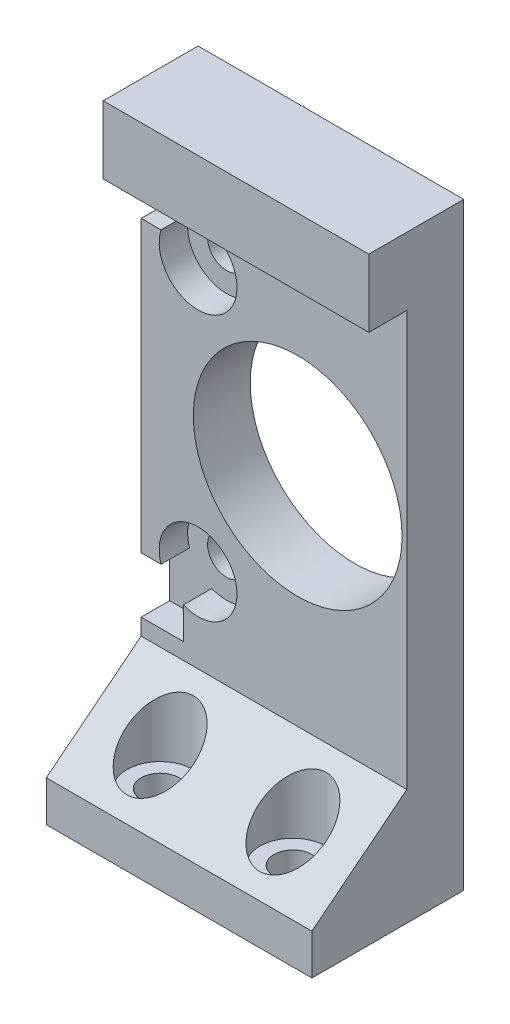
ISO-10303-21;
HEADER;
FILE_DESCRIPTION(('STEP AP214'),'2;1');
FILE_NAME('part.step','',(''),(''),'','','');
FILE_SCHEMA(('AUTOMOTIVE_DESIGN { 1 0 10303 214 1 1 1 1 }'));
ENDSEC;
DATA;
#1=APPLICATION_CONTEXT('core data for automotive mechanical design processes');
#2=APPLICATION_PROTOCOL_DEFINITION('international standard','automotive_design',2000,#1);
#3=PRODUCT_CONTEXT('',#1,'mechanical');
#4=PRODUCT('Part','Part','',(#3));
#5=PRODUCT_RELATED_PRODUCT_CATEGORY('part','',(#4));
#6=PRODUCT_DEFINITION_FORMATION('','',#4);
#7=PRODUCT_DEFINITION_CONTEXT('part definition',#1,'design');
#8=PRODUCT_DEFINITION('design','',#6,#7);
#9=PRODUCT_DEFINITION_SHAPE('','',#8);
#10=(LENGTH_UNIT() NAMED_UNIT(*) SI_UNIT(.MILLI.,.METRE.));
#11=(NAMED_UNIT(*) PLANE_ANGLE_UNIT() SI_UNIT($,.RADIAN.));
#12=(NAMED_UNIT(*) SI_UNIT($,.STERADIAN.) SOLID_ANGLE_UNIT());
#13=UNCERTAINTY_MEASURE_WITH_UNIT(LENGTH_MEASURE(1.E-05),#10,'distance_accuracy_value','');
#14=(GEOMETRIC_REPRESENTATION_CONTEXT(3) GLOBAL_UNCERTAINTY_ASSIGNED_CONTEXT((#13)) GLOBAL_UNIT_ASSIGNED_CONTEXT((#10,
#11,#12)) REPRESENTATION_CONTEXT('',''));
#15=CARTESIAN_POINT('',(0.,0.,0.));
#16=DIRECTION('',(0.,0.,1.));
#17=DIRECTION('',(1.,0.,0.));
#18=AXIS2_PLACEMENT_3D('',#15,#16,#17);
#19=CARTESIAN_POINT('',(0.,0.,6.));
#20=DIRECTION('',(0.,0.,-1.));
#21=DIRECTION('',(-1.,0.,0.));
#22=AXIS2_PLACEMENT_3D('',#19,#20,#21);
#23=PLANE('',#22);
#24=CARTESIAN_POINT('',(-24.1870503597122,36.9280575539568,6.));
#25=DIRECTION('',(0.,0.,-1.));
#26=DIRECTION('',(-1.,0.,0.));
#27=AXIS2_PLACEMENT_3D('',#24,#25,#26);
#28=CIRCLE('',#27,11.);
#29=CARTESIAN_POINT('',(-35.1870503597122,36.9280575539568,6.));
#30=VERTEX_POINT('',#29);
#31=EDGE_CURVE('E263',#30,#30,#28,.F.);
#32=ORIENTED_EDGE('',*,*,#31,.F.);
#33=EDGE_LOOP('',(#32));
#34=FACE_BOUND('',#33,.T.);
#35=DIRECTION('',(1.,0.,0.));
#36=VECTOR('',#35,1.);
#37=CARTESIAN_POINT('',(0.,52.1914288917122,6.));
#38=LINE('',#37,#36);
#39=CARTESIAN_POINT('',(-40.6870503597122,52.1914288917122,6.));
#40=VERTEX_POINT('',#39);
#41=CARTESIAN_POINT('',(-38.5875494127743,52.1914288917122,6.));
#42=VERTEX_POINT('',#41);
#43=EDGE_CURVE('E243',#40,#42,#38,.T.);
#44=ORIENTED_EDGE('',*,*,#43,.F.);
#45=DIRECTION('',(0.,-1.,0.));
#46=VECTOR('',#45,1.);
#47=CARTESIAN_POINT('',(-40.6870503597122,0.,6.));
#48=LINE('',#47,#46);
#49=CARTESIAN_POINT('',(-40.6870503597122,21.6646862162014,6.));
#50=VERTEX_POINT('',#49);
#51=EDGE_CURVE('E294',#40,#50,#48,.T.);
#52=ORIENTED_EDGE('',*,*,#51,.T.);
#53=DIRECTION('',(1.,0.,0.));
#54=VECTOR('',#53,1.);
#55=CARTESIAN_POINT('',(0.,21.6646862162014,6.));
#56=LINE('',#55,#54);
#57=CARTESIAN_POINT('',(-38.5875494127743,21.6646862162014,6.));
#58=VERTEX_POINT('',#57);
#59=EDGE_CURVE('E223',#50,#58,#56,.T.);
#60=ORIENTED_EDGE('',*,*,#59,.T.);
#61=CARTESIAN_POINT('',(-34.6870503597123,22.9280575539568,6.));
#62=DIRECTION('',(0.,0.,1.));
#63=DIRECTION('',(1.,0.,0.));
#64=AXIS2_PLACEMENT_3D('',#61,#62,#63);
#65=CIRCLE('',#64,4.1);
#66=CARTESIAN_POINT('',(-36.2374996052337,19.1325197610924,6.));
#67=VERTEX_POINT('',#66);
#68=EDGE_CURVE('E195',#67,#58,#65,.T.);
#69=ORIENTED_EDGE('',*,*,#68,.F.);
#70=DIRECTION('',(0.,1.,0.));
#71=VECTOR('',#70,1.);
#72=CARTESIAN_POINT('',(-36.2374996052337,0.,6.));
#73=LINE('',#72,#71);
#74=CARTESIAN_POINT('',(-36.2374996052337,15.7891322785426,6.));
#75=VERTEX_POINT('',#74);
#76=EDGE_CURVE('E227',#75,#67,#73,.T.);
#77=ORIENTED_EDGE('',*,*,#76,.F.);
#78=DIRECTION('',(-1.,0.,0.));
#79=VECTOR('',#78,1.);
#80=CARTESIAN_POINT('',(-44.6870503597123,15.7891322785426,6.));
#81=LINE('',#80,#79);
#82=CARTESIAN_POINT('',(-40.6870503597122,15.7891322785426,6.));
#83=VERTEX_POINT('',#82);
#84=EDGE_CURVE('E174',#75,#83,#81,.T.);
#85=ORIENTED_EDGE('',*,*,#84,.T.);
#86=CARTESIAN_POINT('',(-40.6870503597122,14.0583603420339,6.));
#87=VERTEX_POINT('',#86);
#88=EDGE_CURVE('E285',#83,#87,#48,.T.);
#89=ORIENTED_EDGE('',*,*,#88,.T.);
#90=DIRECTION('',(1.,0.,0.));
#91=VECTOR('',#90,1.);
#92=CARTESIAN_POINT('',(-44.6870503597123,14.0583603420339,6.));
#93=LINE('',#92,#91);
#94=CARTESIAN_POINT('',(-12.6870503597123,14.0583603420339,6.));
#95=VERTEX_POINT('',#94);
#96=EDGE_CURVE('E172',#87,#95,#93,.T.);
#97=ORIENTED_EDGE('',*,*,#96,.T.);
#98=DIRECTION('',(0.,1.,0.));
#99=VECTOR('',#98,1.);
#100=CARTESIAN_POINT('',(-12.6870503597123,0.,6.));
#101=LINE('',#100,#99);
#102=CARTESIAN_POINT('',(-12.6870503597122,57.7891322785426,6.));
#103=VERTEX_POINT('',#102);
#104=EDGE_CURVE('E188',#95,#103,#101,.T.);
#105=ORIENTED_EDGE('',*,*,#104,.T.);
#106=DIRECTION('',(-1.,0.,0.));
#107=VECTOR('',#106,1.);
#108=CARTESIAN_POINT('',(-44.6870503597123,57.7891322785426,6.));
#109=LINE('',#108,#107);
#110=CARTESIAN_POINT('',(-36.2374996052337,57.7891322785426,6.));
#111=VERTEX_POINT('',#110);
#112=EDGE_CURVE('E261',#103,#111,#109,.T.);
#113=ORIENTED_EDGE('',*,*,#112,.T.);
#114=DIRECTION('',(0.,-1.,0.));
#115=VECTOR('',#114,1.);
#116=CARTESIAN_POINT('',(-36.2374996052337,0.,6.));
#117=LINE('',#116,#115);
#118=CARTESIAN_POINT('',(-36.2374996052337,54.7235953468212,6.));
#119=VERTEX_POINT('',#118);
#120=EDGE_CURVE('E238',#111,#119,#117,.T.);
#121=ORIENTED_EDGE('',*,*,#120,.T.);
#122=CARTESIAN_POINT('',(-34.6870503597123,50.9280575539568,6.));
#123=DIRECTION('',(0.,0.,1.));
#124=DIRECTION('',(1.,0.,0.));
#125=AXIS2_PLACEMENT_3D('',#122,#123,#124);
#126=CIRCLE('',#125,4.1);
#127=EDGE_CURVE('E199',#42,#119,#126,.T.);
#128=ORIENTED_EDGE('',*,*,#127,.F.);
#129=EDGE_LOOP('',(#44,#52,#60,#69,#77,#85,#89,#97,#105,#113,#121,#128));
#130=FACE_BOUND('',#129,.T.);
#131=ADVANCED_FACE('F35',(#34,#130),#23,.F.);
#132=CARTESIAN_POINT('',(-34.6870503597123,50.9280575539568,-4.));
#133=DIRECTION('',(0.,0.,1.));
#134=DIRECTION('',(1.,0.,0.));
#135=AXIS2_PLACEMENT_3D('',#132,#133,#134);
#136=CYLINDRICAL_SURFACE('',#135,2.);
#137=CARTESIAN_POINT('',(-34.6870503597123,50.9280575539568,0.));
#138=DIRECTION('',(0.,0.,1.));
#139=DIRECTION('',(1.,0.,0.));
#140=AXIS2_PLACEMENT_3D('',#137,#138,#139);
#141=CIRCLE('',#140,2.);
#142=CARTESIAN_POINT('',(-32.6870503597122,50.9280575539568,0.));
#143=VERTEX_POINT('',#142);
#144=EDGE_CURVE('E254',#143,#143,#141,.T.);
#145=ORIENTED_EDGE('',*,*,#144,.F.);
#146=EDGE_LOOP('',(#145));
#147=FACE_BOUND('',#146,.T.);
#148=CARTESIAN_POINT('',(-34.6870503597123,50.9280575539568,3.));
#149=DIRECTION('',(0.,0.,1.));
#150=DIRECTION('',(1.,0.,0.));
#151=AXIS2_PLACEMENT_3D('',#148,#149,#150);
#152=CIRCLE('',#151,2.);
#153=CARTESIAN_POINT('',(-32.6870503597122,50.9280575539568,3.));
#154=VERTEX_POINT('',#153);
#155=EDGE_CURVE('E211',#154,#154,#152,.F.);
#156=ORIENTED_EDGE('',*,*,#155,.F.);
#157=EDGE_LOOP('',(#156));
#158=FACE_BOUND('',#157,.T.);
#159=ADVANCED_FACE('F372',(#147,#158),#136,.F.);
#160=CARTESIAN_POINT('',(-34.6870503597123,22.9280575539568,-4.));
#161=DIRECTION('',(0.,0.,1.));
#162=DIRECTION('',(1.,0.,0.));
#163=AXIS2_PLACEMENT_3D('',#160,#161,#162);
#164=CYLINDRICAL_SURFACE('',#163,2.);
#165=CARTESIAN_POINT('',(-34.6870503597123,22.9280575539568,0.));
#166=DIRECTION('',(0.,0.,1.));
#167=DIRECTION('',(1.,0.,0.));
#168=AXIS2_PLACEMENT_3D('',#165,#166,#167);
#169=CIRCLE('',#168,2.);
#170=CARTESIAN_POINT('',(-32.6870503597122,22.9280575539568,0.));
#171=VERTEX_POINT('',#170);
#172=EDGE_CURVE('E257',#171,#171,#169,.T.);
#173=ORIENTED_EDGE('',*,*,#172,.F.);
#174=EDGE_LOOP('',(#173));
#175=FACE_BOUND('',#174,.T.);
#176=CARTESIAN_POINT('',(-34.6870503597123,22.9280575539568,3.));
#177=DIRECTION('',(0.,0.,1.));
#178=DIRECTION('',(1.,0.,0.));
#179=AXIS2_PLACEMENT_3D('',#176,#177,#178);
#180=CIRCLE('',#179,2.);
#181=CARTESIAN_POINT('',(-32.6870503597122,22.9280575539568,3.));
#182=VERTEX_POINT('',#181);
#183=EDGE_CURVE('E220',#182,#182,#180,.F.);
#184=ORIENTED_EDGE('',*,*,#183,.F.);
#185=EDGE_LOOP('',(#184));
#186=FACE_BOUND('',#185,.T.);
#187=ADVANCED_FACE('F378',(#175,#186),#164,.F.);
#188=CARTESIAN_POINT('',(0.,0.,10.));
#189=DIRECTION('',(0.,0.,1.));
#190=DIRECTION('',(1.,0.,0.));
#191=AXIS2_PLACEMENT_3D('',#188,#189,#190);
#192=PLANE('',#191);
#193=DIRECTION('',(0.,1.,0.));
#194=VECTOR('',#193,1.);
#195=CARTESIAN_POINT('',(-40.6870503597122,0.,10.));
#196=LINE('',#195,#194);
#197=CARTESIAN_POINT('',(-40.6870503597122,57.7891322785426,10.));
#198=VERTEX_POINT('',#197);
#199=CARTESIAN_POINT('',(-40.6870503597122,64.9280575539568,10.));
#200=VERTEX_POINT('',#199);
#201=EDGE_CURVE('E335',#198,#200,#196,.T.);
#202=ORIENTED_EDGE('',*,*,#201,.F.);
#203=DIRECTION('',(-1.,0.,0.));
#204=VECTOR('',#203,1.);
#205=CARTESIAN_POINT('',(-44.6870503597123,57.7891322785426,10.));
#206=LINE('',#205,#204);
#207=CARTESIAN_POINT('',(-12.6870503597122,57.7891322785426,10.));
#208=VERTEX_POINT('',#207);
#209=EDGE_CURVE('E260',#208,#198,#206,.T.);
#210=ORIENTED_EDGE('',*,*,#209,.F.);
#211=DIRECTION('',(0.,-1.,0.));
#212=VECTOR('',#211,1.);
#213=CARTESIAN_POINT('',(-12.6870503597123,0.,10.));
#214=LINE('',#213,#212);
#215=CARTESIAN_POINT('',(-12.6870503597122,64.9280575539568,10.));
#216=VERTEX_POINT('',#215);
#217=EDGE_CURVE('E193',#216,#208,#214,.T.);
#218=ORIENTED_EDGE('',*,*,#217,.F.);
#219=DIRECTION('',(1.,0.,0.));
#220=VECTOR('',#219,1.);
#221=CARTESIAN_POINT('',(-76.1870503597122,64.9280575539568,10.));
#222=LINE('',#221,#220);
#223=EDGE_CURVE('E270',#200,#216,#222,.T.);
#224=ORIENTED_EDGE('',*,*,#223,.F.);
#225=EDGE_LOOP('',(#202,#210,#218,#224));
#226=FACE_BOUND('',#225,.T.);
#227=ADVANCED_FACE('F395',(#226),#192,.T.);
#228=CARTESIAN_POINT('',(0.,0.,0.));
#229=DIRECTION('',(0.,0.,1.));
#230=DIRECTION('',(1.,0.,0.));
#231=AXIS2_PLACEMENT_3D('',#228,#229,#230);
#232=PLANE('',#231);
#233=DIRECTION('',(0.,1.,0.));
#234=VECTOR('',#233,1.);
#235=CARTESIAN_POINT('',(-12.6870503597122,64.9280575539568,0.));
#236=LINE('',#235,#234);
#237=CARTESIAN_POINT('',(-12.6870503597123,1.84805755395684,0.));
#238=VERTEX_POINT('',#237);
#239=CARTESIAN_POINT('',(-12.6870503597122,64.9280575539568,0.));
#240=VERTEX_POINT('',#239);
#241=EDGE_CURVE('E183',#238,#240,#236,.T.);
#242=ORIENTED_EDGE('',*,*,#241,.F.);
#243=DIRECTION('',(-1.,0.,0.));
#244=VECTOR('',#243,1.);
#245=CARTESIAN_POINT('',(0.,1.84805755395684,0.));
#246=LINE('',#245,#244);
#247=CARTESIAN_POINT('',(-40.6870503597122,1.84805755395684,0.));
#248=VERTEX_POINT('',#247);
#249=EDGE_CURVE('E154',#238,#248,#246,.T.);
#250=ORIENTED_EDGE('',*,*,#249,.T.);
#251=DIRECTION('',(0.,1.,0.));
#252=VECTOR('',#251,1.);
#253=CARTESIAN_POINT('',(-40.6870503597122,0.,0.));
#254=LINE('',#253,#252);
#255=CARTESIAN_POINT('',(-40.6870503597122,64.9280575539568,0.));
#256=VERTEX_POINT('',#255);
#257=EDGE_CURVE('E340',#248,#256,#254,.T.);
#258=ORIENTED_EDGE('',*,*,#257,.T.);
#259=DIRECTION('',(1.,0.,0.));
#260=VECTOR('',#259,1.);
#261=CARTESIAN_POINT('',(-76.1870503597122,64.9280575539568,0.));
#262=LINE('',#261,#260);
#263=EDGE_CURVE('E269',#256,#240,#262,.T.);
#264=ORIENTED_EDGE('',*,*,#263,.T.);
#265=EDGE_LOOP('',(#242,#250,#258,#264));
#266=FACE_BOUND('',#265,.T.);
#267=ORIENTED_EDGE('',*,*,#172,.T.);
#268=EDGE_LOOP('',(#267));
#269=FACE_BOUND('',#268,.T.);
#270=ORIENTED_EDGE('',*,*,#144,.T.);
#271=EDGE_LOOP('',(#270));
#272=FACE_BOUND('',#271,.T.);
#273=CARTESIAN_POINT('',(-24.1870503597122,36.9280575539568,0.));
#274=DIRECTION('',(0.,0.,-1.));
#275=DIRECTION('',(-1.,0.,0.));
#276=AXIS2_PLACEMENT_3D('',#273,#274,#275);
#277=CIRCLE('',#276,11.);
#278=CARTESIAN_POINT('',(-35.1870503597122,36.9280575539568,0.));
#279=VERTEX_POINT('',#278);
#280=EDGE_CURVE('E266',#279,#279,#277,.T.);
#281=ORIENTED_EDGE('',*,*,#280,.F.);
#282=EDGE_LOOP('',(#281));
#283=FACE_BOUND('',#282,.T.);
#284=ADVANCED_FACE('F397',(#266,#269,#272,#283),#232,.F.);
#285=CARTESIAN_POINT('',(-76.1870503597122,64.9280575539568,10.));
#286=DIRECTION('',(0.,1.,0.));
#287=DIRECTION('',(0.,0.,1.));
#288=AXIS2_PLACEMENT_3D('',#285,#286,#287);
#289=PLANE('',#288);
#290=DIRECTION('',(0.,0.,-1.));
#291=VECTOR('',#290,1.);
#292=CARTESIAN_POINT('',(-40.6870503597122,64.9280575539568,10.));
#293=LINE('',#292,#291);
#294=EDGE_CURVE('E337',#200,#256,#293,.T.);
#295=ORIENTED_EDGE('',*,*,#294,.F.);
#296=ORIENTED_EDGE('',*,*,#223,.T.);
#297=DIRECTION('',(0.,0.,-1.));
#298=VECTOR('',#297,1.);
#299=CARTESIAN_POINT('',(-12.6870503597122,64.9280575539568,23.));
#300=LINE('',#299,#298);
#301=EDGE_CURVE('E185',#216,#240,#300,.T.);
#302=ORIENTED_EDGE('',*,*,#301,.T.);
#303=ORIENTED_EDGE('',*,*,#263,.F.);
#304=EDGE_LOOP('',(#295,#296,#302,#303));
#305=FACE_BOUND('',#304,.T.);
#306=ADVANCED_FACE('F37',(#305),#289,.T.);
#307=CARTESIAN_POINT('',(-24.1870503597122,36.9280575539568,50.));
#308=DIRECTION('',(0.,0.,-1.));
#309=DIRECTION('',(-1.,0.,0.));
#310=AXIS2_PLACEMENT_3D('',#307,#308,#309);
#311=CYLINDRICAL_SURFACE('',#310,11.);
#312=ORIENTED_EDGE('',*,*,#31,.T.);
#313=EDGE_LOOP('',(#312));
#314=FACE_BOUND('',#313,.T.);
#315=ORIENTED_EDGE('',*,*,#280,.T.);
#316=EDGE_LOOP('',(#315));
#317=FACE_BOUND('',#316,.T.);
#318=ADVANCED_FACE('F387',(#314,#317),#311,.F.);
#319=CARTESIAN_POINT('',(-44.6870503597123,57.7891322785426,6.));
#320=DIRECTION('',(0.,1.,0.));
#321=DIRECTION('',(0.,0.,1.));
#322=AXIS2_PLACEMENT_3D('',#319,#320,#321);
#323=PLANE('',#322);
#324=ORIENTED_EDGE('',*,*,#209,.T.);
#325=DIRECTION('',(0.,0.,-1.));
#326=VECTOR('',#325,1.);
#327=CARTESIAN_POINT('',(-40.6870503597122,57.7891322785426,6.));
#328=LINE('',#327,#326);
#329=CARTESIAN_POINT('',(-40.6870503597122,57.7891322785426,3.));
#330=VERTEX_POINT('',#329);
#331=EDGE_CURVE('E311',#198,#330,#328,.T.);
#332=ORIENTED_EDGE('',*,*,#331,.T.);
#333=DIRECTION('',(-1.,0.,0.));
#334=VECTOR('',#333,1.);
#335=CARTESIAN_POINT('',(0.,57.7891322785426,3.));
#336=LINE('',#335,#334);
#337=CARTESIAN_POINT('',(-36.2374996052337,57.7891322785426,3.));
#338=VERTEX_POINT('',#337);
#339=EDGE_CURVE('E242',#338,#330,#336,.T.);
#340=ORIENTED_EDGE('',*,*,#339,.F.);
#341=DIRECTION('',(0.,0.,1.));
#342=VECTOR('',#341,1.);
#343=CARTESIAN_POINT('',(-36.2374996052337,57.7891322785426,3.));
#344=LINE('',#343,#342);
#345=EDGE_CURVE('E248',#338,#111,#344,.T.);
#346=ORIENTED_EDGE('',*,*,#345,.T.);
#347=ORIENTED_EDGE('',*,*,#112,.F.);
#348=DIRECTION('',(0.,0.,1.));
#349=VECTOR('',#348,1.);
#350=CARTESIAN_POINT('',(-12.6870503597122,57.7891322785426,6.));
#351=LINE('',#350,#349);
#352=EDGE_CURVE('E190',#103,#208,#351,.T.);
#353=ORIENTED_EDGE('',*,*,#352,.T.);
#354=EDGE_LOOP('',(#324,#332,#340,#346,#347,#353));
#355=FACE_BOUND('',#354,.T.);
#356=ADVANCED_FACE('F309',(#355),#323,.F.);
#357=CARTESIAN_POINT('',(-44.6870503597123,15.7891322785426,6.));
#358=DIRECTION('',(0.,-1.,0.));
#359=DIRECTION('',(0.,0.,-1.));
#360=AXIS2_PLACEMENT_3D('',#357,#358,#359);
#361=PLANE('',#360);
#362=DIRECTION('',(1.,0.,0.));
#363=VECTOR('',#362,1.);
#364=CARTESIAN_POINT('',(0.,15.7891322785426,3.));
#365=LINE('',#364,#363);
#366=CARTESIAN_POINT('',(-40.6870503597122,15.7891322785426,3.));
#367=VERTEX_POINT('',#366);
#368=CARTESIAN_POINT('',(-36.2374996052337,15.7891322785426,3.));
#369=VERTEX_POINT('',#368);
#370=EDGE_CURVE('E226',#367,#369,#365,.T.);
#371=ORIENTED_EDGE('',*,*,#370,.F.);
#372=DIRECTION('',(0.,0.,1.));
#373=VECTOR('',#372,1.);
#374=CARTESIAN_POINT('',(-40.6870503597122,15.7891322785426,6.));
#375=LINE('',#374,#373);
#376=EDGE_CURVE('E292',#367,#83,#375,.T.);
#377=ORIENTED_EDGE('',*,*,#376,.T.);
#378=ORIENTED_EDGE('',*,*,#84,.F.);
#379=DIRECTION('',(0.,0.,1.));
#380=VECTOR('',#379,1.);
#381=CARTESIAN_POINT('',(-36.2374996052337,15.7891322785426,3.));
#382=LINE('',#381,#380);
#383=EDGE_CURVE('E232',#369,#75,#382,.T.);
#384=ORIENTED_EDGE('',*,*,#383,.F.);
#385=EDGE_LOOP('',(#371,#377,#378,#384));
#386=FACE_BOUND('',#385,.T.);
#387=ADVANCED_FACE('F386',(#386),#361,.F.);
#388=CARTESIAN_POINT('',(-36.2374996052337,0.,3.));
#389=DIRECTION('',(1.,0.,0.));
#390=DIRECTION('',(0.,0.,-1.));
#391=AXIS2_PLACEMENT_3D('',#388,#389,#390);
#392=PLANE('',#391);
#393=ORIENTED_EDGE('',*,*,#76,.T.);
#394=DIRECTION('',(0.,0.,1.));
#395=VECTOR('',#394,1.);
#396=CARTESIAN_POINT('',(-36.2374996052337,19.1325197610924,3.));
#397=LINE('',#396,#395);
#398=CARTESIAN_POINT('',(-36.2374996052337,19.1325197610924,3.));
#399=VERTEX_POINT('',#398);
#400=EDGE_CURVE('E217',#67,#399,#397,.F.);
#401=ORIENTED_EDGE('',*,*,#400,.T.);
#402=DIRECTION('',(0.,1.,0.));
#403=VECTOR('',#402,1.);
#404=CARTESIAN_POINT('',(-36.2374996052337,0.,3.));
#405=LINE('',#404,#403);
#406=EDGE_CURVE('E229',#369,#399,#405,.T.);
#407=ORIENTED_EDGE('',*,*,#406,.F.);
#408=ORIENTED_EDGE('',*,*,#383,.T.);
#409=EDGE_LOOP('',(#393,#401,#407,#408));
#410=FACE_BOUND('',#409,.T.);
#411=ADVANCED_FACE('F390',(#410),#392,.F.);
#412=CARTESIAN_POINT('',(0.,21.6646862162014,3.));
#413=DIRECTION('',(0.,-1.,0.));
#414=DIRECTION('',(0.,0.,-1.));
#415=AXIS2_PLACEMENT_3D('',#412,#413,#414);
#416=PLANE('',#415);
#417=DIRECTION('',(0.,0.,1.));
#418=VECTOR('',#417,1.);
#419=CARTESIAN_POINT('',(-40.6870503597122,21.6646862162014,3.));
#420=LINE('',#419,#418);
#421=CARTESIAN_POINT('',(-40.6870503597122,21.6646862162014,3.));
#422=VERTEX_POINT('',#421);
#423=EDGE_CURVE('E330',#422,#50,#420,.T.);
#424=ORIENTED_EDGE('',*,*,#423,.F.);
#425=DIRECTION('',(1.,0.,0.));
#426=VECTOR('',#425,1.);
#427=CARTESIAN_POINT('',(0.,21.6646862162014,3.));
#428=LINE('',#427,#426);
#429=CARTESIAN_POINT('',(-38.5875494127743,21.6646862162014,3.));
#430=VERTEX_POINT('',#429);
#431=EDGE_CURVE('E224',#422,#430,#428,.T.);
#432=ORIENTED_EDGE('',*,*,#431,.T.);
#433=DIRECTION('',(0.,0.,1.));
#434=VECTOR('',#433,1.);
#435=CARTESIAN_POINT('',(-38.5875494127743,21.6646862162014,3.));
#436=LINE('',#435,#434);
#437=EDGE_CURVE('E214',#58,#430,#436,.F.);
#438=ORIENTED_EDGE('',*,*,#437,.F.);
#439=ORIENTED_EDGE('',*,*,#59,.F.);
#440=EDGE_LOOP('',(#424,#432,#438,#439));
#441=FACE_BOUND('',#440,.T.);
#442=ADVANCED_FACE('F427',(#441),#416,.T.);
#443=CARTESIAN_POINT('',(0.,0.,3.));
#444=DIRECTION('',(0.,0.,1.));
#445=DIRECTION('',(1.,0.,0.));
#446=AXIS2_PLACEMENT_3D('',#443,#444,#445);
#447=PLANE('',#446);
#448=DIRECTION('',(0.,1.,0.));
#449=VECTOR('',#448,1.);
#450=CARTESIAN_POINT('',(-40.6870503597122,0.,3.));
#451=LINE('',#450,#449);
#452=EDGE_CURVE('E459',#367,#422,#451,.T.);
#453=ORIENTED_EDGE('',*,*,#452,.F.);
#454=ORIENTED_EDGE('',*,*,#370,.T.);
#455=ORIENTED_EDGE('',*,*,#406,.T.);
#456=CARTESIAN_POINT('',(-34.6870503597123,22.9280575539568,3.));
#457=DIRECTION('',(0.,0.,1.));
#458=DIRECTION('',(1.,0.,0.));
#459=AXIS2_PLACEMENT_3D('',#456,#457,#458);
#460=CIRCLE('',#459,4.1);
#461=EDGE_CURVE('E196',#399,#430,#460,.T.);
#462=ORIENTED_EDGE('',*,*,#461,.T.);
#463=ORIENTED_EDGE('',*,*,#431,.F.);
#464=EDGE_LOOP('',(#453,#454,#455,#462,#463));
#465=FACE_BOUND('',#464,.T.);
#466=ORIENTED_EDGE('',*,*,#183,.T.);
#467=EDGE_LOOP('',(#466));
#468=FACE_BOUND('',#467,.T.);
#469=ADVANCED_FACE('F430',(#465,#468),#447,.T.);
#470=CARTESIAN_POINT('',(0.,52.1914288917122,3.));
#471=DIRECTION('',(0.,-1.,0.));
#472=DIRECTION('',(0.,0.,-1.));
#473=AXIS2_PLACEMENT_3D('',#470,#471,#472);
#474=PLANE('',#473);
#475=DIRECTION('',(1.,0.,0.));
#476=VECTOR('',#475,1.);
#477=CARTESIAN_POINT('',(0.,52.1914288917122,3.));
#478=LINE('',#477,#476);
#479=CARTESIAN_POINT('',(-40.6870503597122,52.1914288917122,3.));
#480=VERTEX_POINT('',#479);
#481=CARTESIAN_POINT('',(-38.5875494127743,52.1914288917122,3.));
#482=VERTEX_POINT('',#481);
#483=EDGE_CURVE('E246',#480,#482,#478,.T.);
#484=ORIENTED_EDGE('',*,*,#483,.F.);
#485=DIRECTION('',(0.,0.,1.));
#486=VECTOR('',#485,1.);
#487=CARTESIAN_POINT('',(-40.6870503597122,52.1914288917122,3.));
#488=LINE('',#487,#486);
#489=EDGE_CURVE('E327',#480,#40,#488,.T.);
#490=ORIENTED_EDGE('',*,*,#489,.T.);
#491=ORIENTED_EDGE('',*,*,#43,.T.);
#492=DIRECTION('',(0.,0.,1.));
#493=VECTOR('',#492,1.);
#494=CARTESIAN_POINT('',(-38.5875494127743,52.1914288917122,3.));
#495=LINE('',#494,#493);
#496=EDGE_CURVE('E208',#42,#482,#495,.F.);
#497=ORIENTED_EDGE('',*,*,#496,.T.);
#498=EDGE_LOOP('',(#484,#490,#491,#497));
#499=FACE_BOUND('',#498,.T.);
#500=ADVANCED_FACE('F326',(#499),#474,.F.);
#501=CARTESIAN_POINT('',(-36.2374996052337,0.,3.));
#502=DIRECTION('',(-1.,0.,0.));
#503=DIRECTION('',(0.,0.,1.));
#504=AXIS2_PLACEMENT_3D('',#501,#502,#503);
#505=PLANE('',#504);
#506=DIRECTION('',(0.,0.,1.));
#507=VECTOR('',#506,1.);
#508=CARTESIAN_POINT('',(-36.2374996052337,54.7235953468212,3.));
#509=LINE('',#508,#507);
#510=CARTESIAN_POINT('',(-36.2374996052337,54.7235953468212,3.));
#511=VERTEX_POINT('',#510);
#512=EDGE_CURVE('E204',#119,#511,#509,.F.);
#513=ORIENTED_EDGE('',*,*,#512,.F.);
#514=ORIENTED_EDGE('',*,*,#120,.F.);
#515=ORIENTED_EDGE('',*,*,#345,.F.);
#516=DIRECTION('',(0.,-1.,0.));
#517=VECTOR('',#516,1.);
#518=CARTESIAN_POINT('',(-36.2374996052337,0.,3.));
#519=LINE('',#518,#517);
#520=EDGE_CURVE('E239',#338,#511,#519,.T.);
#521=ORIENTED_EDGE('',*,*,#520,.T.);
#522=EDGE_LOOP('',(#513,#514,#515,#521));
#523=FACE_BOUND('',#522,.T.);
#524=ADVANCED_FACE('F306',(#523),#505,.T.);
#525=CARTESIAN_POINT('',(0.,0.,3.));
#526=DIRECTION('',(0.,0.,1.));
#527=DIRECTION('',(1.,0.,0.));
#528=AXIS2_PLACEMENT_3D('',#525,#526,#527);
#529=PLANE('',#528);
#530=DIRECTION('',(0.,1.,0.));
#531=VECTOR('',#530,1.);
#532=CARTESIAN_POINT('',(-40.6870503597122,0.,3.));
#533=LINE('',#532,#531);
#534=EDGE_CURVE('E316',#480,#330,#533,.T.);
#535=ORIENTED_EDGE('',*,*,#534,.F.);
#536=ORIENTED_EDGE('',*,*,#483,.T.);
#537=CARTESIAN_POINT('',(-34.6870503597123,50.9280575539568,3.));
#538=DIRECTION('',(0.,0.,1.));
#539=DIRECTION('',(1.,0.,0.));
#540=AXIS2_PLACEMENT_3D('',#537,#538,#539);
#541=CIRCLE('',#540,4.1);
#542=EDGE_CURVE('E202',#482,#511,#541,.T.);
#543=ORIENTED_EDGE('',*,*,#542,.T.);
#544=ORIENTED_EDGE('',*,*,#520,.F.);
#545=ORIENTED_EDGE('',*,*,#339,.T.);
#546=EDGE_LOOP('',(#535,#536,#543,#544,#545));
#547=FACE_BOUND('',#546,.T.);
#548=ORIENTED_EDGE('',*,*,#155,.T.);
#549=EDGE_LOOP('',(#548));
#550=FACE_BOUND('',#549,.T.);
#551=ADVANCED_FACE('F314',(#547,#550),#529,.T.);
#552=CARTESIAN_POINT('',(-34.6870503597123,50.9280575539568,3.));
#553=DIRECTION('',(0.,0.,1.));
#554=DIRECTION('',(1.,0.,0.));
#555=AXIS2_PLACEMENT_3D('',#552,#553,#554);
#556=CYLINDRICAL_SURFACE('',#555,4.1);
#557=ORIENTED_EDGE('',*,*,#127,.T.);
#558=ORIENTED_EDGE('',*,*,#512,.T.);
#559=ORIENTED_EDGE('',*,*,#542,.F.);
#560=ORIENTED_EDGE('',*,*,#496,.F.);
#561=EDGE_LOOP('',(#557,#558,#559,#560));
#562=FACE_BOUND('',#561,.T.);
#563=ADVANCED_FACE('F321',(#562),#556,.F.);
#564=CARTESIAN_POINT('',(-34.6870503597123,22.9280575539568,3.));
#565=DIRECTION('',(0.,0.,1.));
#566=DIRECTION('',(1.,0.,0.));
#567=AXIS2_PLACEMENT_3D('',#564,#565,#566);
#568=CYLINDRICAL_SURFACE('',#567,4.1);
#569=ORIENTED_EDGE('',*,*,#68,.T.);
#570=ORIENTED_EDGE('',*,*,#437,.T.);
#571=ORIENTED_EDGE('',*,*,#461,.F.);
#572=ORIENTED_EDGE('',*,*,#400,.F.);
#573=EDGE_LOOP('',(#569,#570,#571,#572));
#574=FACE_BOUND('',#573,.T.);
#575=ADVANCED_FACE('F422',(#574),#568,.F.);
#576=CARTESIAN_POINT('',(-12.6870503597122,64.9280575539568,23.));
#577=DIRECTION('',(-1.,0.,0.));
#578=DIRECTION('',(0.,-1.,0.));
#579=AXIS2_PLACEMENT_3D('',#576,#577,#578);
#580=PLANE('',#579);
#581=DIRECTION('',(0.,1.,0.));
#582=VECTOR('',#581,1.);
#583=CARTESIAN_POINT('',(-12.6870503597123,0.128057553956841,16.));
#584=LINE('',#583,#582);
#585=CARTESIAN_POINT('',(-12.6870503597123,1.84805755395684,16.));
#586=VERTEX_POINT('',#585);
#587=CARTESIAN_POINT('',(-12.6870503597123,6.12805755395684,16.));
#588=VERTEX_POINT('',#587);
#589=EDGE_CURVE('E163',#586,#588,#584,.T.);
#590=ORIENTED_EDGE('',*,*,#589,.F.);
#591=DIRECTION('',(0.,0.,1.));
#592=VECTOR('',#591,1.);
#593=CARTESIAN_POINT('',(-12.6870503597123,1.84805755395684,-34.));
#594=LINE('',#593,#592);
#595=EDGE_CURVE('E151',#238,#586,#594,.T.);
#596=ORIENTED_EDGE('',*,*,#595,.F.);
#597=ORIENTED_EDGE('',*,*,#241,.T.);
#598=ORIENTED_EDGE('',*,*,#301,.F.);
#599=ORIENTED_EDGE('',*,*,#217,.T.);
#600=ORIENTED_EDGE('',*,*,#352,.F.);
#601=ORIENTED_EDGE('',*,*,#104,.F.);
#602=DIRECTION('',(0.,-0.62135951719506,0.783525590131632));
#603=VECTOR('',#602,1.);
#604=CARTESIAN_POINT('',(-12.6870503597123,14.0583603420339,6.));
#605=LINE('',#604,#603);
#606=EDGE_CURVE('E170',#95,#588,#605,.T.);
#607=ORIENTED_EDGE('',*,*,#606,.T.);
#608=EDGE_LOOP('',(#590,#596,#597,#598,#599,#600,#601,#607));
#609=FACE_BOUND('',#608,.T.);
#610=ADVANCED_FACE('F167',(#609),#580,.F.);
#611=CARTESIAN_POINT('',(0.,0.,16.));
#612=DIRECTION('',(0.,0.,-1.));
#613=DIRECTION('',(-1.,0.,0.));
#614=AXIS2_PLACEMENT_3D('',#611,#612,#613);
#615=PLANE('',#614);
#616=DIRECTION('',(0.,1.,0.));
#617=VECTOR('',#616,1.);
#618=CARTESIAN_POINT('',(-40.6870503597122,0.128057553956841,16.));
#619=LINE('',#618,#617);
#620=CARTESIAN_POINT('',(-40.6870503597122,1.84805755395684,16.));
#621=VERTEX_POINT('',#620);
#622=CARTESIAN_POINT('',(-40.6870503597122,6.12805755395684,16.));
#623=VERTEX_POINT('',#622);
#624=EDGE_CURVE('E56',#621,#623,#619,.T.);
#625=ORIENTED_EDGE('',*,*,#624,.F.);
#626=DIRECTION('',(-1.,0.,0.));
#627=VECTOR('',#626,1.);
#628=CARTESIAN_POINT('',(-40.6870503597122,1.84805755395684,16.));
#629=LINE('',#628,#627);
#630=EDGE_CURVE('E50',#586,#621,#629,.T.);
#631=ORIENTED_EDGE('',*,*,#630,.F.);
#632=ORIENTED_EDGE('',*,*,#589,.T.);
#633=DIRECTION('',(-1.,0.,0.));
#634=VECTOR('',#633,1.);
#635=CARTESIAN_POINT('',(-44.6870503597123,6.12805755395684,16.));
#636=LINE('',#635,#634);
#637=EDGE_CURVE('E171',#588,#623,#636,.T.);
#638=ORIENTED_EDGE('',*,*,#637,.T.);
#639=EDGE_LOOP('',(#625,#631,#632,#638));
#640=FACE_BOUND('',#639,.T.);
#641=ADVANCED_FACE('F161',(#640),#615,.F.);
#642=CARTESIAN_POINT('',(-19.6870503597123,-3.87194244604316,11.));
#643=DIRECTION('',(0.,1.,0.));
#644=DIRECTION('',(0.,0.,1.));
#645=AXIS2_PLACEMENT_3D('',#642,#643,#644);
#646=CYLINDRICAL_SURFACE('',#645,2.);
#647=CARTESIAN_POINT('',(-19.6870503597123,1.84805755395684,11.));
#648=DIRECTION('',(0.,1.,0.));
#649=DIRECTION('',(0.,0.,1.));
#650=AXIS2_PLACEMENT_3D('',#647,#648,#649);
#651=CIRCLE('',#650,2.);
#652=CARTESIAN_POINT('',(-19.6870503597123,1.84805755395684,13.));
#653=VERTEX_POINT('',#652);
#654=EDGE_CURVE('E464',#653,#653,#651,.F.);
#655=ORIENTED_EDGE('',*,*,#654,.T.);
#656=EDGE_LOOP('',(#655));
#657=FACE_BOUND('',#656,.T.);
#658=CARTESIAN_POINT('',(-19.6870503597123,6.12805755395684,11.));
#659=DIRECTION('',(0.,-1.,0.));
#660=DIRECTION('',(1.,0.,0.));
#661=AXIS2_PLACEMENT_3D('',#658,#659,#660);
#662=CIRCLE('',#661,2.);
#663=CARTESIAN_POINT('',(-17.6870503597122,6.12805755395684,11.));
#664=VERTEX_POINT('',#663);
#665=EDGE_CURVE('E178',#664,#664,#662,.F.);
#666=ORIENTED_EDGE('',*,*,#665,.T.);
#667=EDGE_LOOP('',(#666));
#668=FACE_BOUND('',#667,.T.);
#669=ADVANCED_FACE('F352',(#657,#668),#646,.F.);
#670=CARTESIAN_POINT('',(-33.6870503597123,-3.87194244604316,11.));
#671=DIRECTION('',(0.,1.,0.));
#672=DIRECTION('',(0.,0.,1.));
#673=AXIS2_PLACEMENT_3D('',#670,#671,#672);
#674=CYLINDRICAL_SURFACE('',#673,2.);
#675=CARTESIAN_POINT('',(-33.6870503597123,1.84805755395684,11.));
#676=DIRECTION('',(0.,1.,0.));
#677=DIRECTION('',(0.,0.,1.));
#678=AXIS2_PLACEMENT_3D('',#675,#676,#677);
#679=CIRCLE('',#678,2.);
#680=CARTESIAN_POINT('',(-33.6870503597123,1.84805755395684,13.));
#681=VERTEX_POINT('',#680);
#682=EDGE_CURVE('E158',#681,#681,#679,.F.);
#683=ORIENTED_EDGE('',*,*,#682,.T.);
#684=EDGE_LOOP('',(#683));
#685=FACE_BOUND('',#684,.T.);
#686=CARTESIAN_POINT('',(-33.6870503597123,6.12805755395684,11.));
#687=DIRECTION('',(0.,-1.,0.));
#688=DIRECTION('',(1.,0.,0.));
#689=AXIS2_PLACEMENT_3D('',#686,#687,#688);
#690=CIRCLE('',#689,2.);
#691=CARTESIAN_POINT('',(-31.6870503597123,6.12805755395684,11.));
#692=VERTEX_POINT('',#691);
#693=EDGE_CURVE('E297',#692,#692,#690,.F.);
#694=ORIENTED_EDGE('',*,*,#693,.T.);
#695=EDGE_LOOP('',(#694));
#696=FACE_BOUND('',#695,.T.);
#697=ADVANCED_FACE('F470',(#685,#696),#674,.F.);
#698=CARTESIAN_POINT('',(-44.6870503597123,14.0583603420339,6.));
#699=DIRECTION('',(0.,0.783525590131632,0.62135951719506));
#700=DIRECTION('',(0.,-0.62135951719506,0.783525590131632));
#701=AXIS2_PLACEMENT_3D('',#698,#699,#700);
#702=PLANE('',#701);
#703=DIRECTION('',(0.,0.62135951719506,-0.783525590131632));
#704=VECTOR('',#703,1.);
#705=CARTESIAN_POINT('',(-40.6870503597122,14.0583603420339,6.));
#706=LINE('',#705,#704);
#707=EDGE_CURVE('E43',#623,#87,#706,.T.);
#708=ORIENTED_EDGE('',*,*,#707,.F.);
#709=ORIENTED_EDGE('',*,*,#637,.F.);
#710=ORIENTED_EDGE('',*,*,#606,.F.);
#711=ORIENTED_EDGE('',*,*,#96,.F.);
#712=EDGE_LOOP('',(#708,#709,#710,#711));
#713=FACE_BOUND('',#712,.T.);
#714=CARTESIAN_POINT('',(-19.6870503597123,10.0932089479954,11.));
#715=DIRECTION('',(0.,0.783525590131632,0.62135951719506));
#716=DIRECTION('',(0.,-0.62135951719506,0.783525590131632));
#717=AXIS2_PLACEMENT_3D('',#714,#715,#716);
#718=ELLIPSE('',#717,4.46698875452428,3.5);
#719=CARTESIAN_POINT('',(-19.6870503597123,7.3176029721684,14.5));
#720=VERTEX_POINT('',#719);
#721=EDGE_CURVE('E279',#720,#720,#718,.T.);
#722=ORIENTED_EDGE('',*,*,#721,.F.);
#723=EDGE_LOOP('',(#722));
#724=FACE_BOUND('',#723,.T.);
#725=CARTESIAN_POINT('',(-33.6870503597123,10.0932089479954,11.));
#726=DIRECTION('',(0.,0.783525590131632,0.62135951719506));
#727=DIRECTION('',(0.,-0.62135951719506,0.783525590131632));
#728=AXIS2_PLACEMENT_3D('',#725,#726,#727);
#729=ELLIPSE('',#728,4.46698875452428,3.5);
#730=CARTESIAN_POINT('',(-33.6870503597123,7.3176029721684,14.5));
#731=VERTEX_POINT('',#730);
#732=EDGE_CURVE('E276',#731,#731,#729,.T.);
#733=ORIENTED_EDGE('',*,*,#732,.F.);
#734=EDGE_LOOP('',(#733));
#735=FACE_BOUND('',#734,.T.);
#736=ADVANCED_FACE('F295',(#713,#724,#735),#702,.T.);
#737=CARTESIAN_POINT('',(-33.6870503597123,6.12805755395684,11.));
#738=DIRECTION('',(0.,-1.,0.));
#739=DIRECTION('',(1.,0.,0.));
#740=AXIS2_PLACEMENT_3D('',#737,#738,#739);
#741=PLANE('',#740);
#742=CARTESIAN_POINT('',(-33.6870503597123,6.12805755395684,11.));
#743=DIRECTION('',(0.,-1.,0.));
#744=DIRECTION('',(1.,0.,0.));
#745=AXIS2_PLACEMENT_3D('',#742,#743,#744);
#746=CIRCLE('',#745,3.5);
#747=CARTESIAN_POINT('',(-30.1870503597123,6.12805755395684,11.));
#748=VERTEX_POINT('',#747);
#749=EDGE_CURVE('E342',#748,#748,#746,.T.);
#750=ORIENTED_EDGE('',*,*,#749,.F.);
#751=EDGE_LOOP('',(#750));
#752=FACE_BOUND('',#751,.T.);
#753=ORIENTED_EDGE('',*,*,#693,.F.);
#754=EDGE_LOOP('',(#753));
#755=FACE_BOUND('',#754,.T.);
#756=ADVANCED_FACE('F366',(#752,#755),#741,.F.);
#757=CARTESIAN_POINT('',(-33.6870503597123,16.1280575539568,11.));
#758=DIRECTION('',(0.,-1.,0.));
#759=DIRECTION('',(1.,0.,0.));
#760=AXIS2_PLACEMENT_3D('',#757,#758,#759);
#761=CYLINDRICAL_SURFACE('',#760,3.5);
#762=ORIENTED_EDGE('',*,*,#732,.T.);
#763=EDGE_LOOP('',(#762));
#764=FACE_BOUND('',#763,.T.);
#765=ORIENTED_EDGE('',*,*,#749,.T.);
#766=EDGE_LOOP('',(#765));
#767=FACE_BOUND('',#766,.T.);
#768=ADVANCED_FACE('F357',(#764,#767),#761,.F.);
#769=CARTESIAN_POINT('',(-19.6870503597123,6.12805755395684,11.));
#770=DIRECTION('',(0.,-1.,0.));
#771=DIRECTION('',(1.,0.,0.));
#772=AXIS2_PLACEMENT_3D('',#769,#770,#771);
#773=PLANE('',#772);
#774=CARTESIAN_POINT('',(-19.6870503597123,6.12805755395684,11.));
#775=DIRECTION('',(0.,-1.,0.));
#776=DIRECTION('',(1.,0.,0.));
#777=AXIS2_PLACEMENT_3D('',#774,#775,#776);
#778=CIRCLE('',#777,3.5);
#779=CARTESIAN_POINT('',(-16.1870503597123,6.12805755395684,11.));
#780=VERTEX_POINT('',#779);
#781=EDGE_CURVE('E280',#780,#780,#778,.T.);
#782=ORIENTED_EDGE('',*,*,#781,.F.);
#783=EDGE_LOOP('',(#782));
#784=FACE_BOUND('',#783,.T.);
#785=ORIENTED_EDGE('',*,*,#665,.F.);
#786=EDGE_LOOP('',(#785));
#787=FACE_BOUND('',#786,.T.);
#788=ADVANCED_FACE('F354',(#784,#787),#773,.F.);
#789=CARTESIAN_POINT('',(-19.6870503597123,16.1280575539568,11.));
#790=DIRECTION('',(0.,-1.,0.));
#791=DIRECTION('',(1.,0.,0.));
#792=AXIS2_PLACEMENT_3D('',#789,#790,#791);
#793=CYLINDRICAL_SURFACE('',#792,3.5);
#794=ORIENTED_EDGE('',*,*,#721,.T.);
#795=EDGE_LOOP('',(#794));
#796=FACE_BOUND('',#795,.T.);
#797=ORIENTED_EDGE('',*,*,#781,.T.);
#798=EDGE_LOOP('',(#797));
#799=FACE_BOUND('',#798,.T.);
#800=ADVANCED_FACE('F356',(#796,#799),#793,.F.);
#801=CARTESIAN_POINT('',(-40.6870503597122,0.128057553956841,-94.));
#802=DIRECTION('',(1.,0.,0.));
#803=DIRECTION('',(0.,0.,-1.));
#804=AXIS2_PLACEMENT_3D('',#801,#802,#803);
#805=PLANE('',#804);
#806=ORIENTED_EDGE('',*,*,#257,.F.);
#807=DIRECTION('',(0.,0.,1.));
#808=VECTOR('',#807,1.);
#809=CARTESIAN_POINT('',(-40.6870503597122,1.84805755395684,-94.));
#810=LINE('',#809,#808);
#811=EDGE_CURVE('E11',#248,#621,#810,.T.);
#812=ORIENTED_EDGE('',*,*,#811,.T.);
#813=ORIENTED_EDGE('',*,*,#624,.T.);
#814=ORIENTED_EDGE('',*,*,#707,.T.);
#815=ORIENTED_EDGE('',*,*,#88,.F.);
#816=ORIENTED_EDGE('',*,*,#376,.F.);
#817=ORIENTED_EDGE('',*,*,#452,.T.);
#818=ORIENTED_EDGE('',*,*,#423,.T.);
#819=ORIENTED_EDGE('',*,*,#51,.F.);
#820=ORIENTED_EDGE('',*,*,#489,.F.);
#821=ORIENTED_EDGE('',*,*,#534,.T.);
#822=ORIENTED_EDGE('',*,*,#331,.F.);
#823=ORIENTED_EDGE('',*,*,#201,.T.);
#824=ORIENTED_EDGE('',*,*,#294,.T.);
#825=EDGE_LOOP('',(#806,#812,#813,#814,#815,#816,#817,#818,#819,#820,#821,#822,#823,#824));
#826=FACE_BOUND('',#825,.T.);
#827=ADVANCED_FACE('F284',(#826),#805,.F.);
#828=CARTESIAN_POINT('',(-40.6870503597122,1.84805755395684,-34.));
#829=DIRECTION('',(0.,1.,0.));
#830=DIRECTION('',(0.,0.,1.));
#831=AXIS2_PLACEMENT_3D('',#828,#829,#830);
#832=PLANE('',#831);
#833=ORIENTED_EDGE('',*,*,#682,.F.);
#834=EDGE_LOOP('',(#833));
#835=FACE_BOUND('',#834,.T.);
#836=ORIENTED_EDGE('',*,*,#654,.F.);
#837=EDGE_LOOP('',(#836));
#838=FACE_BOUND('',#837,.T.);
#839=ORIENTED_EDGE('',*,*,#595,.T.);
#840=ORIENTED_EDGE('',*,*,#630,.T.);
#841=ORIENTED_EDGE('',*,*,#811,.F.);
#842=ORIENTED_EDGE('',*,*,#249,.F.);
#843=EDGE_LOOP('',(#839,#840,#841,#842));
#844=FACE_BOUND('',#843,.T.);
#845=ADVANCED_FACE('F152',(#835,#838,#844),#832,.F.);
#846=CLOSED_SHELL('',(#131,#159,#187,#227,#284,#306,#318,#356,#387,#411,#442,#469,#500,#524,
#551,#563,#575,#610,#641,#669,#697,#736,#756,#768,#788,#800,#827,#845));
#847=MANIFOLD_SOLID_BREP('B2',#846);
#848=ADVANCED_BREP_SHAPE_REPRESENTATION('',(#18,#847),#14);
#849=SHAPE_DEFINITION_REPRESENTATION(#9,#848);
ENDSEC;
END-ISO-10303-21;
